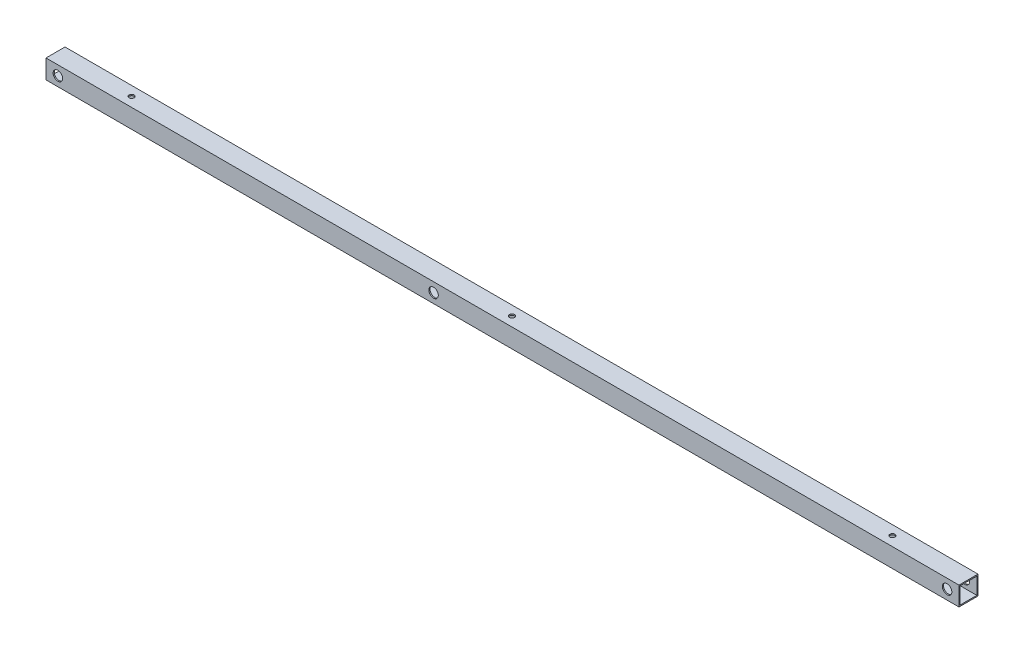
ISO-10303-21;
HEADER;
FILE_DESCRIPTION(('STEP AP214'),'2;1');
FILE_NAME('part.step','',(''),(''),'','','');
FILE_SCHEMA(('AUTOMOTIVE_DESIGN { 1 0 10303 214 1 1 1 1 }'));
ENDSEC;
DATA;
#1=APPLICATION_CONTEXT('core data for automotive mechanical design processes');
#2=APPLICATION_PROTOCOL_DEFINITION('international standard','automotive_design',2000,#1);
#3=PRODUCT_CONTEXT('',#1,'mechanical');
#4=PRODUCT('Part','Part','',(#3));
#5=PRODUCT_RELATED_PRODUCT_CATEGORY('part','',(#4));
#6=PRODUCT_DEFINITION_FORMATION('','',#4);
#7=PRODUCT_DEFINITION_CONTEXT('part definition',#1,'design');
#8=PRODUCT_DEFINITION('design','',#6,#7);
#9=PRODUCT_DEFINITION_SHAPE('','',#8);
#10=(LENGTH_UNIT() NAMED_UNIT(*) SI_UNIT(.MILLI.,.METRE.));
#11=(NAMED_UNIT(*) PLANE_ANGLE_UNIT() SI_UNIT($,.RADIAN.));
#12=(NAMED_UNIT(*) SI_UNIT($,.STERADIAN.) SOLID_ANGLE_UNIT());
#13=UNCERTAINTY_MEASURE_WITH_UNIT(LENGTH_MEASURE(1.E-05),#10,'distance_accuracy_value','');
#14=(GEOMETRIC_REPRESENTATION_CONTEXT(3) GLOBAL_UNCERTAINTY_ASSIGNED_CONTEXT((#13)) GLOBAL_UNIT_ASSIGNED_CONTEXT((#10,
#11,#12)) REPRESENTATION_CONTEXT('',''));
#15=CARTESIAN_POINT('',(0.,0.,0.));
#16=DIRECTION('',(0.,0.,1.));
#17=DIRECTION('',(1.,0.,0.));
#18=AXIS2_PLACEMENT_3D('',#15,#16,#17);
#19=CARTESIAN_POINT('',(609.6,-12.7,12.7));
#20=DIRECTION('',(0.,0.,-1.));
#21=DIRECTION('',(-1.,0.,0.));
#22=AXIS2_PLACEMENT_3D('',#19,#20,#21);
#23=PLANE('',#22);
#24=CARTESIAN_POINT('',(-593.725,0.,12.7));
#25=DIRECTION('',(0.,0.,1.));
#26=DIRECTION('',(1.,0.,0.));
#27=AXIS2_PLACEMENT_3D('',#24,#25,#26);
#28=CIRCLE('',#27,6.34999999999997);
#29=CARTESIAN_POINT('',(-587.375,0.,12.7));
#30=VERTEX_POINT('',#29);
#31=EDGE_CURVE('E208',#30,#30,#28,.T.);
#32=ORIENTED_EDGE('',*,*,#31,.F.);
#33=EDGE_LOOP('',(#32));
#34=FACE_BOUND('',#33,.T.);
#35=CARTESIAN_POINT('',(593.725,0.,12.7));
#36=DIRECTION('',(0.,0.,1.));
#37=DIRECTION('',(1.,0.,0.));
#38=AXIS2_PLACEMENT_3D('',#35,#36,#37);
#39=CIRCLE('',#38,6.34999999999997);
#40=CARTESIAN_POINT('',(600.075,0.,12.7));
#41=VERTEX_POINT('',#40);
#42=EDGE_CURVE('E205',#41,#41,#39,.T.);
#43=ORIENTED_EDGE('',*,*,#42,.F.);
#44=EDGE_LOOP('',(#43));
#45=FACE_BOUND('',#44,.T.);
#46=DIRECTION('',(0.,-1.,0.));
#47=VECTOR('',#46,1.);
#48=CARTESIAN_POINT('',(-609.6,-12.7,12.7));
#49=LINE('',#48,#47);
#50=CARTESIAN_POINT('',(-609.6,12.7,12.7));
#51=VERTEX_POINT('',#50);
#52=CARTESIAN_POINT('',(-609.6,-12.7,12.7));
#53=VERTEX_POINT('',#52);
#54=EDGE_CURVE('E189',#51,#53,#49,.T.);
#55=ORIENTED_EDGE('',*,*,#54,.T.);
#56=DIRECTION('',(-1.,0.,0.));
#57=VECTOR('',#56,1.);
#58=CARTESIAN_POINT('',(609.6,-12.7,12.7));
#59=LINE('',#58,#57);
#60=CARTESIAN_POINT('',(609.6,-12.7,12.7));
#61=VERTEX_POINT('',#60);
#62=EDGE_CURVE('E194',#61,#53,#59,.T.);
#63=ORIENTED_EDGE('',*,*,#62,.F.);
#64=DIRECTION('',(0.,-1.,0.));
#65=VECTOR('',#64,1.);
#66=CARTESIAN_POINT('',(609.6,-12.7,12.7));
#67=LINE('',#66,#65);
#68=CARTESIAN_POINT('',(609.6,12.7,12.7));
#69=VERTEX_POINT('',#68);
#70=EDGE_CURVE('E180',#69,#61,#67,.T.);
#71=ORIENTED_EDGE('',*,*,#70,.F.);
#72=DIRECTION('',(-1.,0.,0.));
#73=VECTOR('',#72,1.);
#74=CARTESIAN_POINT('',(609.6,12.7,12.7));
#75=LINE('',#74,#73);
#76=EDGE_CURVE('E77',#69,#51,#75,.T.);
#77=ORIENTED_EDGE('',*,*,#76,.T.);
#78=EDGE_LOOP('',(#55,#63,#71,#77));
#79=FACE_BOUND('',#78,.T.);
#80=CARTESIAN_POINT('',(-92.0749999999999,0.,12.7));
#81=DIRECTION('',(0.,0.,1.));
#82=DIRECTION('',(1.,0.,0.));
#83=AXIS2_PLACEMENT_3D('',#80,#81,#82);
#84=CIRCLE('',#83,6.34999999999999);
#85=CARTESIAN_POINT('',(-85.7249999999999,0.,12.7));
#86=VERTEX_POINT('',#85);
#87=EDGE_CURVE('E228',#86,#86,#84,.T.);
#88=ORIENTED_EDGE('',*,*,#87,.F.);
#89=EDGE_LOOP('',(#88));
#90=FACE_BOUND('',#89,.T.);
#91=ADVANCED_FACE('F68',(#34,#45,#79,#90),#23,.F.);
#92=CARTESIAN_POINT('',(609.6,0.,0.));
#93=DIRECTION('',(1.,0.,0.));
#94=DIRECTION('',(0.,0.,-1.));
#95=AXIS2_PLACEMENT_3D('',#92,#93,#94);
#96=PLANE('',#95);
#97=DIRECTION('',(0.,1.,0.));
#98=VECTOR('',#97,1.);
#99=CARTESIAN_POINT('',(609.6,-12.7,-12.7));
#100=LINE('',#99,#98);
#101=CARTESIAN_POINT('',(609.6,-12.7,-12.7));
#102=VERTEX_POINT('',#101);
#103=CARTESIAN_POINT('',(609.6,12.7,-12.7));
#104=VERTEX_POINT('',#103);
#105=EDGE_CURVE('E174',#102,#104,#100,.T.);
#106=ORIENTED_EDGE('',*,*,#105,.T.);
#107=DIRECTION('',(0.,0.,1.));
#108=VECTOR('',#107,1.);
#109=CARTESIAN_POINT('',(609.6,12.7,12.7));
#110=LINE('',#109,#108);
#111=EDGE_CURVE('E177',#104,#69,#110,.T.);
#112=ORIENTED_EDGE('',*,*,#111,.T.);
#113=ORIENTED_EDGE('',*,*,#70,.T.);
#114=DIRECTION('',(0.,0.,-1.));
#115=VECTOR('',#114,1.);
#116=CARTESIAN_POINT('',(609.6,-12.7,12.7));
#117=LINE('',#116,#115);
#118=EDGE_CURVE('E182',#61,#102,#117,.T.);
#119=ORIENTED_EDGE('',*,*,#118,.T.);
#120=EDGE_LOOP('',(#106,#112,#113,#119));
#121=FACE_BOUND('',#120,.T.);
#122=DIRECTION('',(0.,0.,1.));
#123=VECTOR('',#122,1.);
#124=CARTESIAN_POINT('',(609.6,11.1125,0.));
#125=LINE('',#124,#123);
#126=CARTESIAN_POINT('',(609.6,11.1125,-11.1125));
#127=VERTEX_POINT('',#126);
#128=CARTESIAN_POINT('',(609.6,11.1125,11.1125));
#129=VERTEX_POINT('',#128);
#130=EDGE_CURVE('E143',#127,#129,#125,.T.);
#131=ORIENTED_EDGE('',*,*,#130,.F.);
#132=DIRECTION('',(0.,1.,0.));
#133=VECTOR('',#132,1.);
#134=CARTESIAN_POINT('',(609.6,0.,-11.1125));
#135=LINE('',#134,#133);
#136=CARTESIAN_POINT('',(609.6,-11.1125,-11.1125));
#137=VERTEX_POINT('',#136);
#138=EDGE_CURVE('E135',#137,#127,#135,.T.);
#139=ORIENTED_EDGE('',*,*,#138,.F.);
#140=DIRECTION('',(0.,0.,-1.));
#141=VECTOR('',#140,1.);
#142=CARTESIAN_POINT('',(609.6,-11.1125,0.));
#143=LINE('',#142,#141);
#144=CARTESIAN_POINT('',(609.6,-11.1125,11.1125));
#145=VERTEX_POINT('',#144);
#146=EDGE_CURVE('E158',#145,#137,#143,.T.);
#147=ORIENTED_EDGE('',*,*,#146,.F.);
#148=DIRECTION('',(0.,-1.,0.));
#149=VECTOR('',#148,1.);
#150=CARTESIAN_POINT('',(609.6,0.,11.1125));
#151=LINE('',#150,#149);
#152=EDGE_CURVE('E156',#129,#145,#151,.T.);
#153=ORIENTED_EDGE('',*,*,#152,.F.);
#154=EDGE_LOOP('',(#131,#139,#147,#153));
#155=FACE_BOUND('',#154,.T.);
#156=ADVANCED_FACE('F155',(#121,#155),#96,.T.);
#157=CARTESIAN_POINT('',(-609.6,0.,0.));
#158=DIRECTION('',(1.,0.,0.));
#159=DIRECTION('',(0.,0.,-1.));
#160=AXIS2_PLACEMENT_3D('',#157,#158,#159);
#161=PLANE('',#160);
#162=DIRECTION('',(0.,1.,0.));
#163=VECTOR('',#162,1.);
#164=CARTESIAN_POINT('',(-609.6,-12.7,-12.7));
#165=LINE('',#164,#163);
#166=CARTESIAN_POINT('',(-609.6,-12.7,-12.7));
#167=VERTEX_POINT('',#166);
#168=CARTESIAN_POINT('',(-609.6,12.7,-12.7));
#169=VERTEX_POINT('',#168);
#170=EDGE_CURVE('E151',#167,#169,#165,.T.);
#171=ORIENTED_EDGE('',*,*,#170,.F.);
#172=DIRECTION('',(0.,0.,-1.));
#173=VECTOR('',#172,1.);
#174=CARTESIAN_POINT('',(-609.6,-12.7,12.7));
#175=LINE('',#174,#173);
#176=EDGE_CURVE('E178',#53,#167,#175,.T.);
#177=ORIENTED_EDGE('',*,*,#176,.F.);
#178=ORIENTED_EDGE('',*,*,#54,.F.);
#179=DIRECTION('',(0.,0.,1.));
#180=VECTOR('',#179,1.);
#181=CARTESIAN_POINT('',(-609.6,12.7,12.7));
#182=LINE('',#181,#180);
#183=EDGE_CURVE('E187',#169,#51,#182,.T.);
#184=ORIENTED_EDGE('',*,*,#183,.F.);
#185=EDGE_LOOP('',(#171,#177,#178,#184));
#186=FACE_BOUND('',#185,.T.);
#187=DIRECTION('',(0.,1.,0.));
#188=VECTOR('',#187,1.);
#189=CARTESIAN_POINT('',(-609.6,0.,-11.1125));
#190=LINE('',#189,#188);
#191=CARTESIAN_POINT('',(-609.6,-11.1125,-11.1125));
#192=VERTEX_POINT('',#191);
#193=CARTESIAN_POINT('',(-609.6,11.1125,-11.1125));
#194=VERTEX_POINT('',#193);
#195=EDGE_CURVE('E93',#192,#194,#190,.T.);
#196=ORIENTED_EDGE('',*,*,#195,.T.);
#197=DIRECTION('',(0.,0.,1.));
#198=VECTOR('',#197,1.);
#199=CARTESIAN_POINT('',(-609.6,11.1125,0.));
#200=LINE('',#199,#198);
#201=CARTESIAN_POINT('',(-609.6,11.1125,11.1125));
#202=VERTEX_POINT('',#201);
#203=EDGE_CURVE('E150',#194,#202,#200,.T.);
#204=ORIENTED_EDGE('',*,*,#203,.T.);
#205=DIRECTION('',(0.,-1.,0.));
#206=VECTOR('',#205,1.);
#207=CARTESIAN_POINT('',(-609.6,0.,11.1125));
#208=LINE('',#207,#206);
#209=CARTESIAN_POINT('',(-609.6,-11.1125,11.1125));
#210=VERTEX_POINT('',#209);
#211=EDGE_CURVE('E166',#202,#210,#208,.T.);
#212=ORIENTED_EDGE('',*,*,#211,.T.);
#213=DIRECTION('',(0.,0.,-1.));
#214=VECTOR('',#213,1.);
#215=CARTESIAN_POINT('',(-609.6,-11.1125,0.));
#216=LINE('',#215,#214);
#217=EDGE_CURVE('E144',#210,#192,#216,.T.);
#218=ORIENTED_EDGE('',*,*,#217,.T.);
#219=EDGE_LOOP('',(#196,#204,#212,#218));
#220=FACE_BOUND('',#219,.T.);
#221=ADVANCED_FACE('F250',(#186,#220),#161,.F.);
#222=CARTESIAN_POINT('',(609.6,-12.7,-12.7));
#223=DIRECTION('',(0.,0.,1.));
#224=DIRECTION('',(1.,0.,0.));
#225=AXIS2_PLACEMENT_3D('',#222,#223,#224);
#226=PLANE('',#225);
#227=CARTESIAN_POINT('',(-593.725,0.,-12.7));
#228=DIRECTION('',(0.,0.,1.));
#229=DIRECTION('',(1.,0.,0.));
#230=AXIS2_PLACEMENT_3D('',#227,#228,#229);
#231=CIRCLE('',#230,6.34999999999997);
#232=CARTESIAN_POINT('',(-587.375,0.,-12.7));
#233=VERTEX_POINT('',#232);
#234=EDGE_CURVE('E201',#233,#233,#231,.T.);
#235=ORIENTED_EDGE('',*,*,#234,.T.);
#236=EDGE_LOOP('',(#235));
#237=FACE_BOUND('',#236,.T.);
#238=CARTESIAN_POINT('',(593.725,0.,-12.7));
#239=DIRECTION('',(0.,0.,1.));
#240=DIRECTION('',(1.,0.,0.));
#241=AXIS2_PLACEMENT_3D('',#238,#239,#240);
#242=CIRCLE('',#241,6.34999999999997);
#243=CARTESIAN_POINT('',(600.075,0.,-12.7));
#244=VERTEX_POINT('',#243);
#245=EDGE_CURVE('E219',#244,#244,#242,.T.);
#246=ORIENTED_EDGE('',*,*,#245,.T.);
#247=EDGE_LOOP('',(#246));
#248=FACE_BOUND('',#247,.T.);
#249=CARTESIAN_POINT('',(-92.0749999999999,0.,-12.7));
#250=DIRECTION('',(0.,0.,1.));
#251=DIRECTION('',(1.,0.,0.));
#252=AXIS2_PLACEMENT_3D('',#249,#250,#251);
#253=CIRCLE('',#252,6.34999999999999);
#254=CARTESIAN_POINT('',(-85.7249999999999,0.,-12.7));
#255=VERTEX_POINT('',#254);
#256=EDGE_CURVE('E231',#255,#255,#253,.T.);
#257=ORIENTED_EDGE('',*,*,#256,.T.);
#258=EDGE_LOOP('',(#257));
#259=FACE_BOUND('',#258,.T.);
#260=ORIENTED_EDGE('',*,*,#170,.T.);
#261=DIRECTION('',(-1.,0.,0.));
#262=VECTOR('',#261,1.);
#263=CARTESIAN_POINT('',(609.6,12.7,-12.7));
#264=LINE('',#263,#262);
#265=EDGE_CURVE('E14',#104,#169,#264,.T.);
#266=ORIENTED_EDGE('',*,*,#265,.F.);
#267=ORIENTED_EDGE('',*,*,#105,.F.);
#268=DIRECTION('',(-1.,0.,0.));
#269=VECTOR('',#268,1.);
#270=CARTESIAN_POINT('',(609.6,-12.7,-12.7));
#271=LINE('',#270,#269);
#272=EDGE_CURVE('E184',#102,#167,#271,.T.);
#273=ORIENTED_EDGE('',*,*,#272,.T.);
#274=EDGE_LOOP('',(#260,#266,#267,#273));
#275=FACE_BOUND('',#274,.T.);
#276=ADVANCED_FACE('F70',(#237,#248,#259,#275),#226,.F.);
#277=CARTESIAN_POINT('',(609.6,12.7,12.7));
#278=DIRECTION('',(0.,-1.,0.));
#279=DIRECTION('',(0.,0.,-1.));
#280=AXIS2_PLACEMENT_3D('',#277,#278,#279);
#281=PLANE('',#280);
#282=CARTESIAN_POINT('',(-508.,12.7,0.));
#283=DIRECTION('',(0.,1.,0.));
#284=DIRECTION('',(0.,0.,1.));
#285=AXIS2_PLACEMENT_3D('',#282,#283,#284);
#286=CIRCLE('',#285,3.3782);
#287=CARTESIAN_POINT('',(-508.,12.7,3.3782));
#288=VERTEX_POINT('',#287);
#289=EDGE_CURVE('E285',#288,#288,#286,.T.);
#290=ORIENTED_EDGE('',*,*,#289,.F.);
#291=EDGE_LOOP('',(#290));
#292=FACE_BOUND('',#291,.T.);
#293=CARTESIAN_POINT('',(0.,12.7,0.));
#294=DIRECTION('',(0.,1.,0.));
#295=DIRECTION('',(0.,0.,1.));
#296=AXIS2_PLACEMENT_3D('',#293,#294,#295);
#297=CIRCLE('',#296,3.3782);
#298=CARTESIAN_POINT('',(0.,12.7,3.3782));
#299=VERTEX_POINT('',#298);
#300=EDGE_CURVE('E289',#299,#299,#297,.T.);
#301=ORIENTED_EDGE('',*,*,#300,.F.);
#302=EDGE_LOOP('',(#301));
#303=FACE_BOUND('',#302,.T.);
#304=CARTESIAN_POINT('',(508.,12.7,0.));
#305=DIRECTION('',(0.,1.,0.));
#306=DIRECTION('',(0.,0.,1.));
#307=AXIS2_PLACEMENT_3D('',#304,#305,#306);
#308=CIRCLE('',#307,3.3782);
#309=CARTESIAN_POINT('',(508.,12.7,3.3782));
#310=VERTEX_POINT('',#309);
#311=EDGE_CURVE('E293',#310,#310,#308,.T.);
#312=ORIENTED_EDGE('',*,*,#311,.F.);
#313=EDGE_LOOP('',(#312));
#314=FACE_BOUND('',#313,.T.);
#315=ORIENTED_EDGE('',*,*,#183,.T.);
#316=ORIENTED_EDGE('',*,*,#76,.F.);
#317=ORIENTED_EDGE('',*,*,#111,.F.);
#318=ORIENTED_EDGE('',*,*,#265,.T.);
#319=EDGE_LOOP('',(#315,#316,#317,#318));
#320=FACE_BOUND('',#319,.T.);
#321=ADVANCED_FACE('F274',(#292,#303,#314,#320),#281,.F.);
#322=CARTESIAN_POINT('',(609.6,-12.7,12.7));
#323=DIRECTION('',(0.,1.,0.));
#324=DIRECTION('',(0.,0.,1.));
#325=AXIS2_PLACEMENT_3D('',#322,#323,#324);
#326=PLANE('',#325);
#327=CARTESIAN_POINT('',(-508.,-12.7,0.));
#328=DIRECTION('',(0.,1.,0.));
#329=DIRECTION('',(0.,0.,1.));
#330=AXIS2_PLACEMENT_3D('',#327,#328,#329);
#331=CIRCLE('',#330,3.3782);
#332=CARTESIAN_POINT('',(-508.,-12.7,3.3782));
#333=VERTEX_POINT('',#332);
#334=EDGE_CURVE('E348',#333,#333,#331,.T.);
#335=ORIENTED_EDGE('',*,*,#334,.T.);
#336=EDGE_LOOP('',(#335));
#337=FACE_BOUND('',#336,.T.);
#338=CARTESIAN_POINT('',(0.,-12.7,0.));
#339=DIRECTION('',(0.,1.,0.));
#340=DIRECTION('',(0.,0.,1.));
#341=AXIS2_PLACEMENT_3D('',#338,#339,#340);
#342=CIRCLE('',#341,3.37819999999999);
#343=CARTESIAN_POINT('',(0.,-12.7,3.37819999999999));
#344=VERTEX_POINT('',#343);
#345=EDGE_CURVE('E343',#344,#344,#342,.T.);
#346=ORIENTED_EDGE('',*,*,#345,.T.);
#347=EDGE_LOOP('',(#346));
#348=FACE_BOUND('',#347,.T.);
#349=CARTESIAN_POINT('',(508.,-12.7,0.));
#350=DIRECTION('',(0.,1.,0.));
#351=DIRECTION('',(0.,0.,1.));
#352=AXIS2_PLACEMENT_3D('',#349,#350,#351);
#353=CIRCLE('',#352,3.3782);
#354=CARTESIAN_POINT('',(508.,-12.7,3.3782));
#355=VERTEX_POINT('',#354);
#356=EDGE_CURVE('E332',#355,#355,#353,.T.);
#357=ORIENTED_EDGE('',*,*,#356,.T.);
#358=EDGE_LOOP('',(#357));
#359=FACE_BOUND('',#358,.T.);
#360=ORIENTED_EDGE('',*,*,#176,.T.);
#361=ORIENTED_EDGE('',*,*,#272,.F.);
#362=ORIENTED_EDGE('',*,*,#118,.F.);
#363=ORIENTED_EDGE('',*,*,#62,.T.);
#364=EDGE_LOOP('',(#360,#361,#362,#363));
#365=FACE_BOUND('',#364,.T.);
#366=ADVANCED_FACE('F272',(#337,#348,#359,#365),#326,.F.);
#367=CARTESIAN_POINT('',(609.6,0.,-11.1125));
#368=DIRECTION('',(0.,0.,1.));
#369=DIRECTION('',(1.,0.,0.));
#370=AXIS2_PLACEMENT_3D('',#367,#368,#369);
#371=PLANE('',#370);
#372=CARTESIAN_POINT('',(-593.725,0.,-11.1125));
#373=DIRECTION('',(0.,0.,1.));
#374=DIRECTION('',(1.,0.,0.));
#375=AXIS2_PLACEMENT_3D('',#372,#373,#374);
#376=CIRCLE('',#375,6.34999999999997);
#377=CARTESIAN_POINT('',(-587.375,0.,-11.1125));
#378=VERTEX_POINT('',#377);
#379=EDGE_CURVE('E200',#378,#378,#376,.T.);
#380=ORIENTED_EDGE('',*,*,#379,.F.);
#381=EDGE_LOOP('',(#380));
#382=FACE_BOUND('',#381,.T.);
#383=CARTESIAN_POINT('',(593.725,0.,-11.1125));
#384=DIRECTION('',(0.,0.,1.));
#385=DIRECTION('',(1.,0.,0.));
#386=AXIS2_PLACEMENT_3D('',#383,#384,#385);
#387=CIRCLE('',#386,6.34999999999997);
#388=CARTESIAN_POINT('',(600.075,0.,-11.1125));
#389=VERTEX_POINT('',#388);
#390=EDGE_CURVE('E222',#389,#389,#387,.T.);
#391=ORIENTED_EDGE('',*,*,#390,.F.);
#392=EDGE_LOOP('',(#391));
#393=FACE_BOUND('',#392,.T.);
#394=CARTESIAN_POINT('',(-92.0749999999999,0.,-11.1125));
#395=DIRECTION('',(0.,0.,1.));
#396=DIRECTION('',(1.,0.,0.));
#397=AXIS2_PLACEMENT_3D('',#394,#395,#396);
#398=CIRCLE('',#397,6.34999999999999);
#399=CARTESIAN_POINT('',(-85.7249999999999,0.,-11.1125));
#400=VERTEX_POINT('',#399);
#401=EDGE_CURVE('E234',#400,#400,#398,.T.);
#402=ORIENTED_EDGE('',*,*,#401,.F.);
#403=EDGE_LOOP('',(#402));
#404=FACE_BOUND('',#403,.T.);
#405=ORIENTED_EDGE('',*,*,#195,.F.);
#406=DIRECTION('',(-1.,0.,0.));
#407=VECTOR('',#406,1.);
#408=CARTESIAN_POINT('',(609.6,-11.1125,-11.1125));
#409=LINE('',#408,#407);
#410=EDGE_CURVE('E139',#137,#192,#409,.T.);
#411=ORIENTED_EDGE('',*,*,#410,.F.);
#412=ORIENTED_EDGE('',*,*,#138,.T.);
#413=DIRECTION('',(-1.,0.,0.));
#414=VECTOR('',#413,1.);
#415=CARTESIAN_POINT('',(609.6,11.1125,-11.1125));
#416=LINE('',#415,#414);
#417=EDGE_CURVE('E138',#127,#194,#416,.T.);
#418=ORIENTED_EDGE('',*,*,#417,.T.);
#419=EDGE_LOOP('',(#405,#411,#412,#418));
#420=FACE_BOUND('',#419,.T.);
#421=ADVANCED_FACE('F137',(#382,#393,#404,#420),#371,.T.);
#422=CARTESIAN_POINT('',(609.6,11.1125,0.));
#423=DIRECTION('',(0.,-1.,0.));
#424=DIRECTION('',(0.,0.,-1.));
#425=AXIS2_PLACEMENT_3D('',#422,#423,#424);
#426=PLANE('',#425);
#427=CARTESIAN_POINT('',(-508.,11.1125,0.));
#428=DIRECTION('',(0.,-1.,0.));
#429=DIRECTION('',(0.,0.,-1.));
#430=AXIS2_PLACEMENT_3D('',#427,#428,#429);
#431=CIRCLE('',#430,3.3782);
#432=CARTESIAN_POINT('',(-508.,11.1125,-3.3782));
#433=VERTEX_POINT('',#432);
#434=EDGE_CURVE('E323',#433,#433,#431,.T.);
#435=ORIENTED_EDGE('',*,*,#434,.F.);
#436=EDGE_LOOP('',(#435));
#437=FACE_BOUND('',#436,.T.);
#438=CARTESIAN_POINT('',(0.,11.1125,0.));
#439=DIRECTION('',(0.,-1.,0.));
#440=DIRECTION('',(0.,0.,-1.));
#441=AXIS2_PLACEMENT_3D('',#438,#439,#440);
#442=CIRCLE('',#441,3.3782);
#443=CARTESIAN_POINT('',(0.,11.1125,-3.3782));
#444=VERTEX_POINT('',#443);
#445=EDGE_CURVE('E327',#444,#444,#442,.T.);
#446=ORIENTED_EDGE('',*,*,#445,.F.);
#447=EDGE_LOOP('',(#446));
#448=FACE_BOUND('',#447,.T.);
#449=CARTESIAN_POINT('',(508.,11.1125,0.));
#450=DIRECTION('',(0.,-1.,0.));
#451=DIRECTION('',(0.,0.,-1.));
#452=AXIS2_PLACEMENT_3D('',#449,#450,#451);
#453=CIRCLE('',#452,3.3782);
#454=CARTESIAN_POINT('',(508.,11.1125,-3.3782));
#455=VERTEX_POINT('',#454);
#456=EDGE_CURVE('E330',#455,#455,#453,.T.);
#457=ORIENTED_EDGE('',*,*,#456,.F.);
#458=EDGE_LOOP('',(#457));
#459=FACE_BOUND('',#458,.T.);
#460=ORIENTED_EDGE('',*,*,#203,.F.);
#461=ORIENTED_EDGE('',*,*,#417,.F.);
#462=ORIENTED_EDGE('',*,*,#130,.T.);
#463=DIRECTION('',(-1.,0.,0.));
#464=VECTOR('',#463,1.);
#465=CARTESIAN_POINT('',(609.6,11.1125,11.1125));
#466=LINE('',#465,#464);
#467=EDGE_CURVE('E152',#129,#202,#466,.T.);
#468=ORIENTED_EDGE('',*,*,#467,.T.);
#469=EDGE_LOOP('',(#460,#461,#462,#468));
#470=FACE_BOUND('',#469,.T.);
#471=ADVANCED_FACE('F147',(#437,#448,#459,#470),#426,.T.);
#472=CARTESIAN_POINT('',(609.6,0.,11.1125));
#473=DIRECTION('',(0.,0.,-1.));
#474=DIRECTION('',(-1.,0.,0.));
#475=AXIS2_PLACEMENT_3D('',#472,#473,#474);
#476=PLANE('',#475);
#477=CARTESIAN_POINT('',(-593.725,0.,11.1125));
#478=DIRECTION('',(0.,0.,-1.));
#479=DIRECTION('',(-1.,0.,0.));
#480=AXIS2_PLACEMENT_3D('',#477,#478,#479);
#481=CIRCLE('',#480,6.34999999999997);
#482=CARTESIAN_POINT('',(-600.075,0.,11.1125));
#483=VERTEX_POINT('',#482);
#484=EDGE_CURVE('E198',#483,#483,#481,.T.);
#485=ORIENTED_EDGE('',*,*,#484,.F.);
#486=EDGE_LOOP('',(#485));
#487=FACE_BOUND('',#486,.T.);
#488=CARTESIAN_POINT('',(593.725,0.,11.1125));
#489=DIRECTION('',(0.,0.,-1.));
#490=DIRECTION('',(-1.,0.,0.));
#491=AXIS2_PLACEMENT_3D('',#488,#489,#490);
#492=CIRCLE('',#491,6.34999999999997);
#493=CARTESIAN_POINT('',(587.375,0.,11.1125));
#494=VERTEX_POINT('',#493);
#495=EDGE_CURVE('E225',#494,#494,#492,.T.);
#496=ORIENTED_EDGE('',*,*,#495,.F.);
#497=EDGE_LOOP('',(#496));
#498=FACE_BOUND('',#497,.T.);
#499=CARTESIAN_POINT('',(-92.0749999999999,0.,11.1125));
#500=DIRECTION('',(0.,0.,-1.));
#501=DIRECTION('',(-1.,0.,0.));
#502=AXIS2_PLACEMENT_3D('',#499,#500,#501);
#503=CIRCLE('',#502,6.34999999999999);
#504=CARTESIAN_POINT('',(-98.4249999999999,0.,11.1125));
#505=VERTEX_POINT('',#504);
#506=EDGE_CURVE('E164',#505,#505,#503,.T.);
#507=ORIENTED_EDGE('',*,*,#506,.F.);
#508=EDGE_LOOP('',(#507));
#509=FACE_BOUND('',#508,.T.);
#510=ORIENTED_EDGE('',*,*,#211,.F.);
#511=ORIENTED_EDGE('',*,*,#467,.F.);
#512=ORIENTED_EDGE('',*,*,#152,.T.);
#513=DIRECTION('',(-1.,0.,0.));
#514=VECTOR('',#513,1.);
#515=CARTESIAN_POINT('',(609.6,-11.1125,11.1125));
#516=LINE('',#515,#514);
#517=EDGE_CURVE('E85',#145,#210,#516,.T.);
#518=ORIENTED_EDGE('',*,*,#517,.T.);
#519=EDGE_LOOP('',(#510,#511,#512,#518));
#520=FACE_BOUND('',#519,.T.);
#521=ADVANCED_FACE('F242',(#487,#498,#509,#520),#476,.T.);
#522=CARTESIAN_POINT('',(609.6,-11.1125,0.));
#523=DIRECTION('',(0.,1.,0.));
#524=DIRECTION('',(0.,0.,1.));
#525=AXIS2_PLACEMENT_3D('',#522,#523,#524);
#526=PLANE('',#525);
#527=CARTESIAN_POINT('',(-508.,-11.1125,0.));
#528=DIRECTION('',(0.,1.,0.));
#529=DIRECTION('',(0.,0.,1.));
#530=AXIS2_PLACEMENT_3D('',#527,#528,#529);
#531=CIRCLE('',#530,3.3782);
#532=CARTESIAN_POINT('',(-508.,-11.1125,3.3782));
#533=VERTEX_POINT('',#532);
#534=EDGE_CURVE('E72',#533,#533,#531,.T.);
#535=ORIENTED_EDGE('',*,*,#534,.F.);
#536=EDGE_LOOP('',(#535));
#537=FACE_BOUND('',#536,.T.);
#538=CARTESIAN_POINT('',(0.,-11.1125,0.));
#539=DIRECTION('',(0.,1.,0.));
#540=DIRECTION('',(0.,0.,1.));
#541=AXIS2_PLACEMENT_3D('',#538,#539,#540);
#542=CIRCLE('',#541,3.3782);
#543=CARTESIAN_POINT('',(0.,-11.1125,3.3782));
#544=VERTEX_POINT('',#543);
#545=EDGE_CURVE('E339',#544,#544,#542,.T.);
#546=ORIENTED_EDGE('',*,*,#545,.F.);
#547=EDGE_LOOP('',(#546));
#548=FACE_BOUND('',#547,.T.);
#549=CARTESIAN_POINT('',(508.,-11.1125,0.));
#550=DIRECTION('',(0.,1.,0.));
#551=DIRECTION('',(0.,0.,1.));
#552=AXIS2_PLACEMENT_3D('',#549,#550,#551);
#553=CIRCLE('',#552,3.3782);
#554=CARTESIAN_POINT('',(508.,-11.1125,3.3782));
#555=VERTEX_POINT('',#554);
#556=EDGE_CURVE('E213',#555,#555,#553,.T.);
#557=ORIENTED_EDGE('',*,*,#556,.F.);
#558=EDGE_LOOP('',(#557));
#559=FACE_BOUND('',#558,.T.);
#560=ORIENTED_EDGE('',*,*,#217,.F.);
#561=ORIENTED_EDGE('',*,*,#517,.F.);
#562=ORIENTED_EDGE('',*,*,#146,.T.);
#563=ORIENTED_EDGE('',*,*,#410,.T.);
#564=EDGE_LOOP('',(#560,#561,#562,#563));
#565=FACE_BOUND('',#564,.T.);
#566=ADVANCED_FACE('F245',(#537,#548,#559,#565),#526,.T.);
#567=CARTESIAN_POINT('',(-92.0749999999999,0.,12.7));
#568=DIRECTION('',(0.,0.,1.));
#569=DIRECTION('',(1.,0.,0.));
#570=AXIS2_PLACEMENT_3D('',#567,#568,#569);
#571=CYLINDRICAL_SURFACE('',#570,6.34999999999999);
#572=ORIENTED_EDGE('',*,*,#506,.T.);
#573=EDGE_LOOP('',(#572));
#574=FACE_BOUND('',#573,.T.);
#575=ORIENTED_EDGE('',*,*,#87,.T.);
#576=EDGE_LOOP('',(#575));
#577=FACE_BOUND('',#576,.T.);
#578=ADVANCED_FACE('F239',(#574,#577),#571,.F.);
#579=ORIENTED_EDGE('',*,*,#401,.T.);
#580=EDGE_LOOP('',(#579));
#581=FACE_BOUND('',#580,.T.);
#582=ORIENTED_EDGE('',*,*,#256,.F.);
#583=EDGE_LOOP('',(#582));
#584=FACE_BOUND('',#583,.T.);
#585=ADVANCED_FACE('F257',(#581,#584),#571,.F.);
#586=CARTESIAN_POINT('',(593.725,0.,12.7));
#587=DIRECTION('',(0.,0.,1.));
#588=DIRECTION('',(1.,0.,0.));
#589=AXIS2_PLACEMENT_3D('',#586,#587,#588);
#590=CYLINDRICAL_SURFACE('',#589,6.34999999999997);
#591=ORIENTED_EDGE('',*,*,#390,.T.);
#592=EDGE_LOOP('',(#591));
#593=FACE_BOUND('',#592,.T.);
#594=ORIENTED_EDGE('',*,*,#245,.F.);
#595=EDGE_LOOP('',(#594));
#596=FACE_BOUND('',#595,.T.);
#597=ADVANCED_FACE('F375',(#593,#596),#590,.F.);
#598=ORIENTED_EDGE('',*,*,#495,.T.);
#599=EDGE_LOOP('',(#598));
#600=FACE_BOUND('',#599,.T.);
#601=ORIENTED_EDGE('',*,*,#42,.T.);
#602=EDGE_LOOP('',(#601));
#603=FACE_BOUND('',#602,.T.);
#604=ADVANCED_FACE('F377',(#600,#603),#590,.F.);
#605=CARTESIAN_POINT('',(-593.725,0.,12.7));
#606=DIRECTION('',(0.,0.,1.));
#607=DIRECTION('',(1.,0.,0.));
#608=AXIS2_PLACEMENT_3D('',#605,#606,#607);
#609=CYLINDRICAL_SURFACE('',#608,6.34999999999997);
#610=ORIENTED_EDGE('',*,*,#379,.T.);
#611=EDGE_LOOP('',(#610));
#612=FACE_BOUND('',#611,.T.);
#613=ORIENTED_EDGE('',*,*,#234,.F.);
#614=EDGE_LOOP('',(#613));
#615=FACE_BOUND('',#614,.T.);
#616=ADVANCED_FACE('F374',(#612,#615),#609,.F.);
#617=ORIENTED_EDGE('',*,*,#484,.T.);
#618=EDGE_LOOP('',(#617));
#619=FACE_BOUND('',#618,.T.);
#620=ORIENTED_EDGE('',*,*,#31,.T.);
#621=EDGE_LOOP('',(#620));
#622=FACE_BOUND('',#621,.T.);
#623=ADVANCED_FACE('F371',(#619,#622),#609,.F.);
#624=CARTESIAN_POINT('',(508.,12.7,0.));
#625=DIRECTION('',(0.,1.,0.));
#626=DIRECTION('',(0.,0.,1.));
#627=AXIS2_PLACEMENT_3D('',#624,#625,#626);
#628=CYLINDRICAL_SURFACE('',#627,3.3782);
#629=ORIENTED_EDGE('',*,*,#556,.T.);
#630=EDGE_LOOP('',(#629));
#631=FACE_BOUND('',#630,.T.);
#632=ORIENTED_EDGE('',*,*,#356,.F.);
#633=EDGE_LOOP('',(#632));
#634=FACE_BOUND('',#633,.T.);
#635=ADVANCED_FACE('F370',(#631,#634),#628,.F.);
#636=ORIENTED_EDGE('',*,*,#456,.T.);
#637=EDGE_LOOP('',(#636));
#638=FACE_BOUND('',#637,.T.);
#639=ORIENTED_EDGE('',*,*,#311,.T.);
#640=EDGE_LOOP('',(#639));
#641=FACE_BOUND('',#640,.T.);
#642=ADVANCED_FACE('F367',(#638,#641),#628,.F.);
#643=CARTESIAN_POINT('',(0.,12.7,0.));
#644=DIRECTION('',(0.,1.,0.));
#645=DIRECTION('',(0.,0.,1.));
#646=AXIS2_PLACEMENT_3D('',#643,#644,#645);
#647=CYLINDRICAL_SURFACE('',#646,3.3782);
#648=ORIENTED_EDGE('',*,*,#545,.T.);
#649=EDGE_LOOP('',(#648));
#650=FACE_BOUND('',#649,.T.);
#651=ORIENTED_EDGE('',*,*,#345,.F.);
#652=EDGE_LOOP('',(#651));
#653=FACE_BOUND('',#652,.T.);
#654=ADVANCED_FACE('F365',(#650,#653),#647,.F.);
#655=ORIENTED_EDGE('',*,*,#445,.T.);
#656=EDGE_LOOP('',(#655));
#657=FACE_BOUND('',#656,.T.);
#658=ORIENTED_EDGE('',*,*,#300,.T.);
#659=EDGE_LOOP('',(#658));
#660=FACE_BOUND('',#659,.T.);
#661=ADVANCED_FACE('F360',(#657,#660),#647,.F.);
#662=CARTESIAN_POINT('',(-508.,12.7,0.));
#663=DIRECTION('',(0.,1.,0.));
#664=DIRECTION('',(0.,0.,1.));
#665=AXIS2_PLACEMENT_3D('',#662,#663,#664);
#666=CYLINDRICAL_SURFACE('',#665,3.3782);
#667=ORIENTED_EDGE('',*,*,#534,.T.);
#668=EDGE_LOOP('',(#667));
#669=FACE_BOUND('',#668,.T.);
#670=ORIENTED_EDGE('',*,*,#334,.F.);
#671=EDGE_LOOP('',(#670));
#672=FACE_BOUND('',#671,.T.);
#673=ADVANCED_FACE('F354',(#669,#672),#666,.F.);
#674=ORIENTED_EDGE('',*,*,#434,.T.);
#675=EDGE_LOOP('',(#674));
#676=FACE_BOUND('',#675,.T.);
#677=ORIENTED_EDGE('',*,*,#289,.T.);
#678=EDGE_LOOP('',(#677));
#679=FACE_BOUND('',#678,.T.);
#680=ADVANCED_FACE('F352',(#676,#679),#666,.F.);
#681=CLOSED_SHELL('',(#91,#156,#221,#276,#321,#366,#421,#471,#521,#566,#578,#585,#597,#604,#616,
#623,#635,#642,#654,#661,#673,#680));
#682=MANIFOLD_SOLID_BREP('B2',#681);
#683=ADVANCED_BREP_SHAPE_REPRESENTATION('',(#18,#682),#14);
#684=SHAPE_DEFINITION_REPRESENTATION(#9,#683);
ENDSEC;
END-ISO-10303-21;
